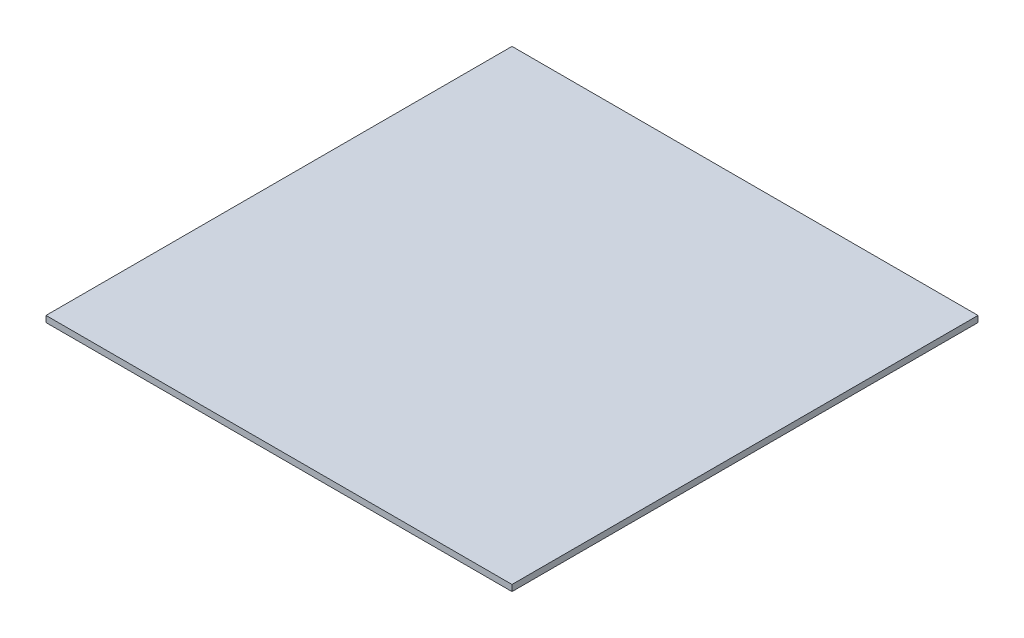
ISO-10303-21;
HEADER;
FILE_DESCRIPTION(('STEP AP214'),'2;1');
FILE_NAME('part.step','',(''),(''),'','','');
FILE_SCHEMA(('AUTOMOTIVE_DESIGN { 1 0 10303 214 1 1 1 1 }'));
ENDSEC;
DATA;
#1=APPLICATION_CONTEXT('core data for automotive mechanical design processes');
#2=APPLICATION_PROTOCOL_DEFINITION('international standard','automotive_design',2000,#1);
#3=PRODUCT_CONTEXT('',#1,'mechanical');
#4=PRODUCT('Part','Part','',(#3));
#5=PRODUCT_RELATED_PRODUCT_CATEGORY('part','',(#4));
#6=PRODUCT_DEFINITION_FORMATION('','',#4);
#7=PRODUCT_DEFINITION_CONTEXT('part definition',#1,'design');
#8=PRODUCT_DEFINITION('design','',#6,#7);
#9=PRODUCT_DEFINITION_SHAPE('','',#8);
#10=(LENGTH_UNIT() NAMED_UNIT(*) SI_UNIT(.MILLI.,.METRE.));
#11=(NAMED_UNIT(*) PLANE_ANGLE_UNIT() SI_UNIT($,.RADIAN.));
#12=(NAMED_UNIT(*) SI_UNIT($,.STERADIAN.) SOLID_ANGLE_UNIT());
#13=UNCERTAINTY_MEASURE_WITH_UNIT(LENGTH_MEASURE(1.E-05),#10,'distance_accuracy_value','');
#14=(GEOMETRIC_REPRESENTATION_CONTEXT(3) GLOBAL_UNCERTAINTY_ASSIGNED_CONTEXT((#13)) GLOBAL_UNIT_ASSIGNED_CONTEXT((#10,
#11,#12)) REPRESENTATION_CONTEXT('',''));
#15=CARTESIAN_POINT('',(0.,0.,0.));
#16=DIRECTION('',(0.,0.,1.));
#17=DIRECTION('',(1.,0.,0.));
#18=AXIS2_PLACEMENT_3D('',#15,#16,#17);
#19=CARTESIAN_POINT('',(75.,2.,-75.));
#20=DIRECTION('',(-1.,0.,0.));
#21=DIRECTION('',(0.,0.,1.));
#22=AXIS2_PLACEMENT_3D('',#19,#20,#21);
#23=PLANE('',#22);
#24=DIRECTION('',(0.,0.,-1.));
#25=VECTOR('',#24,1.);
#26=CARTESIAN_POINT('',(75.,0.,-75.));
#27=LINE('',#26,#25);
#28=CARTESIAN_POINT('',(75.,0.,75.));
#29=VERTEX_POINT('',#28);
#30=CARTESIAN_POINT('',(75.,0.,-75.));
#31=VERTEX_POINT('',#30);
#32=EDGE_CURVE('E107',#29,#31,#27,.T.);
#33=ORIENTED_EDGE('',*,*,#32,.T.);
#34=DIRECTION('',(0.,-1.,0.));
#35=VECTOR('',#34,1.);
#36=CARTESIAN_POINT('',(75.,2.,-75.));
#37=LINE('',#36,#35);
#38=CARTESIAN_POINT('',(75.,2.,-75.));
#39=VERTEX_POINT('',#38);
#40=EDGE_CURVE('E11',#39,#31,#37,.T.);
#41=ORIENTED_EDGE('',*,*,#40,.F.);
#42=DIRECTION('',(0.,0.,-1.));
#43=VECTOR('',#42,1.);
#44=CARTESIAN_POINT('',(75.,2.,-75.));
#45=LINE('',#44,#43);
#46=CARTESIAN_POINT('',(75.,2.,75.));
#47=VERTEX_POINT('',#46);
#48=EDGE_CURVE('E91',#47,#39,#45,.T.);
#49=ORIENTED_EDGE('',*,*,#48,.F.);
#50=DIRECTION('',(0.,-1.,0.));
#51=VECTOR('',#50,1.);
#52=CARTESIAN_POINT('',(75.,2.,75.));
#53=LINE('',#52,#51);
#54=EDGE_CURVE('E103',#47,#29,#53,.T.);
#55=ORIENTED_EDGE('',*,*,#54,.T.);
#56=EDGE_LOOP('',(#33,#41,#49,#55));
#57=FACE_BOUND('',#56,.T.);
#58=ADVANCED_FACE('F39',(#57),#23,.F.);
#59=CARTESIAN_POINT('',(-75.,2.,-75.));
#60=DIRECTION('',(0.,0.,1.));
#61=DIRECTION('',(1.,0.,0.));
#62=AXIS2_PLACEMENT_3D('',#59,#60,#61);
#63=PLANE('',#62);
#64=DIRECTION('',(-1.,0.,0.));
#65=VECTOR('',#64,1.);
#66=CARTESIAN_POINT('',(-75.,0.,-75.));
#67=LINE('',#66,#65);
#68=CARTESIAN_POINT('',(-75.,0.,-75.));
#69=VERTEX_POINT('',#68);
#70=EDGE_CURVE('E96',#31,#69,#67,.T.);
#71=ORIENTED_EDGE('',*,*,#70,.T.);
#72=DIRECTION('',(0.,-1.,0.));
#73=VECTOR('',#72,1.);
#74=CARTESIAN_POINT('',(-75.,2.,-75.));
#75=LINE('',#74,#73);
#76=CARTESIAN_POINT('',(-75.,2.,-75.));
#77=VERTEX_POINT('',#76);
#78=EDGE_CURVE('E48',#77,#69,#75,.T.);
#79=ORIENTED_EDGE('',*,*,#78,.F.);
#80=DIRECTION('',(-1.,0.,0.));
#81=VECTOR('',#80,1.);
#82=CARTESIAN_POINT('',(-75.,2.,-75.));
#83=LINE('',#82,#81);
#84=EDGE_CURVE('E86',#39,#77,#83,.T.);
#85=ORIENTED_EDGE('',*,*,#84,.F.);
#86=ORIENTED_EDGE('',*,*,#40,.T.);
#87=EDGE_LOOP('',(#71,#79,#85,#86));
#88=FACE_BOUND('',#87,.T.);
#89=ADVANCED_FACE('F95',(#88),#63,.F.);
#90=CARTESIAN_POINT('',(-75.,2.,-75.));
#91=DIRECTION('',(1.,0.,0.));
#92=DIRECTION('',(0.,0.,-1.));
#93=AXIS2_PLACEMENT_3D('',#90,#91,#92);
#94=PLANE('',#93);
#95=DIRECTION('',(0.,0.,1.));
#96=VECTOR('',#95,1.);
#97=CARTESIAN_POINT('',(-75.,0.,-75.));
#98=LINE('',#97,#96);
#99=CARTESIAN_POINT('',(-75.,0.,75.));
#100=VERTEX_POINT('',#99);
#101=EDGE_CURVE('E73',#69,#100,#98,.T.);
#102=ORIENTED_EDGE('',*,*,#101,.T.);
#103=DIRECTION('',(0.,-1.,0.));
#104=VECTOR('',#103,1.);
#105=CARTESIAN_POINT('',(-75.,2.,75.));
#106=LINE('',#105,#104);
#107=CARTESIAN_POINT('',(-75.,2.,75.));
#108=VERTEX_POINT('',#107);
#109=EDGE_CURVE('E98',#108,#100,#106,.T.);
#110=ORIENTED_EDGE('',*,*,#109,.F.);
#111=DIRECTION('',(0.,0.,1.));
#112=VECTOR('',#111,1.);
#113=CARTESIAN_POINT('',(-75.,2.,-75.));
#114=LINE('',#113,#112);
#115=EDGE_CURVE('E89',#77,#108,#114,.T.);
#116=ORIENTED_EDGE('',*,*,#115,.F.);
#117=ORIENTED_EDGE('',*,*,#78,.T.);
#118=EDGE_LOOP('',(#102,#110,#116,#117));
#119=FACE_BOUND('',#118,.T.);
#120=ADVANCED_FACE('F99',(#119),#94,.F.);
#121=CARTESIAN_POINT('',(-75.,2.,75.));
#122=DIRECTION('',(0.,0.,-1.));
#123=DIRECTION('',(-1.,0.,0.));
#124=AXIS2_PLACEMENT_3D('',#121,#122,#123);
#125=PLANE('',#124);
#126=DIRECTION('',(1.,0.,0.));
#127=VECTOR('',#126,1.);
#128=CARTESIAN_POINT('',(-75.,0.,75.));
#129=LINE('',#128,#127);
#130=EDGE_CURVE('E79',#100,#29,#129,.T.);
#131=ORIENTED_EDGE('',*,*,#130,.T.);
#132=ORIENTED_EDGE('',*,*,#54,.F.);
#133=DIRECTION('',(1.,0.,0.));
#134=VECTOR('',#133,1.);
#135=CARTESIAN_POINT('',(-75.,2.,75.));
#136=LINE('',#135,#134);
#137=EDGE_CURVE('E56',#108,#47,#136,.T.);
#138=ORIENTED_EDGE('',*,*,#137,.F.);
#139=ORIENTED_EDGE('',*,*,#109,.T.);
#140=EDGE_LOOP('',(#131,#132,#138,#139));
#141=FACE_BOUND('',#140,.T.);
#142=ADVANCED_FACE('F120',(#141),#125,.F.);
#143=CARTESIAN_POINT('',(0.,2.,0.));
#144=DIRECTION('',(0.,1.,0.));
#145=DIRECTION('',(0.,0.,1.));
#146=AXIS2_PLACEMENT_3D('',#143,#144,#145);
#147=PLANE('',#146);
#148=ORIENTED_EDGE('',*,*,#48,.T.);
#149=ORIENTED_EDGE('',*,*,#84,.T.);
#150=ORIENTED_EDGE('',*,*,#115,.T.);
#151=ORIENTED_EDGE('',*,*,#137,.T.);
#152=EDGE_LOOP('',(#148,#149,#150,#151));
#153=FACE_BOUND('',#152,.T.);
#154=ADVANCED_FACE('F87',(#153),#147,.T.);
#155=CARTESIAN_POINT('',(0.,0.,0.));
#156=DIRECTION('',(0.,1.,0.));
#157=DIRECTION('',(0.,0.,1.));
#158=AXIS2_PLACEMENT_3D('',#155,#156,#157);
#159=PLANE('',#158);
#160=ORIENTED_EDGE('',*,*,#32,.F.);
#161=ORIENTED_EDGE('',*,*,#130,.F.);
#162=ORIENTED_EDGE('',*,*,#101,.F.);
#163=ORIENTED_EDGE('',*,*,#70,.F.);
#164=EDGE_LOOP('',(#160,#161,#162,#163));
#165=FACE_BOUND('',#164,.T.);
#166=ADVANCED_FACE('F123',(#165),#159,.F.);
#167=CLOSED_SHELL('',(#58,#89,#120,#142,#154,#166));
#168=MANIFOLD_SOLID_BREP('B2',#167);
#169=ADVANCED_BREP_SHAPE_REPRESENTATION('',(#18,#168),#14);
#170=SHAPE_DEFINITION_REPRESENTATION(#9,#169);
ENDSEC;
END-ISO-10303-21;
